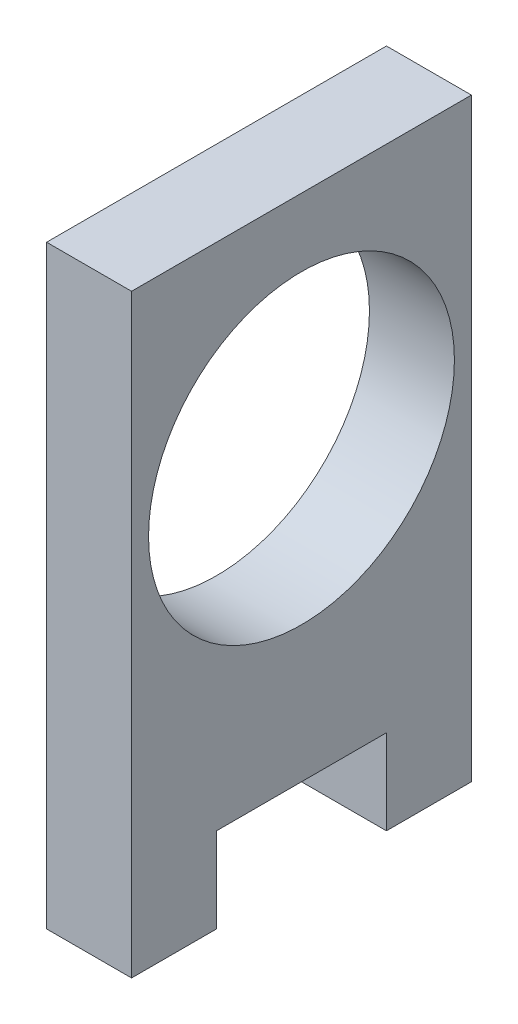
ISO-10303-21;
HEADER;
FILE_DESCRIPTION(('STEP AP214'),'2;1');
FILE_NAME('part.step','',(''),(''),'','','');
FILE_SCHEMA(('AUTOMOTIVE_DESIGN { 1 0 10303 214 1 1 1 1 }'));
ENDSEC;
DATA;
#1=APPLICATION_CONTEXT('core data for automotive mechanical design processes');
#2=APPLICATION_PROTOCOL_DEFINITION('international standard','automotive_design',2000,#1);
#3=PRODUCT_CONTEXT('',#1,'mechanical');
#4=PRODUCT('Part','Part','',(#3));
#5=PRODUCT_RELATED_PRODUCT_CATEGORY('part','',(#4));
#6=PRODUCT_DEFINITION_FORMATION('','',#4);
#7=PRODUCT_DEFINITION_CONTEXT('part definition',#1,'design');
#8=PRODUCT_DEFINITION('design','',#6,#7);
#9=PRODUCT_DEFINITION_SHAPE('','',#8);
#10=(LENGTH_UNIT() NAMED_UNIT(*) SI_UNIT(.MILLI.,.METRE.));
#11=(NAMED_UNIT(*) PLANE_ANGLE_UNIT() SI_UNIT($,.RADIAN.));
#12=(NAMED_UNIT(*) SI_UNIT($,.STERADIAN.) SOLID_ANGLE_UNIT());
#13=UNCERTAINTY_MEASURE_WITH_UNIT(LENGTH_MEASURE(1.E-05),#10,'distance_accuracy_value','');
#14=(GEOMETRIC_REPRESENTATION_CONTEXT(3) GLOBAL_UNCERTAINTY_ASSIGNED_CONTEXT((#13)) GLOBAL_UNIT_ASSIGNED_CONTEXT((#10,
#11,#12)) REPRESENTATION_CONTEXT('',''));
#15=CARTESIAN_POINT('',(0.,0.,0.));
#16=DIRECTION('',(0.,0.,1.));
#17=DIRECTION('',(1.,0.,0.));
#18=AXIS2_PLACEMENT_3D('',#15,#16,#17);
#19=CARTESIAN_POINT('',(6.35,0.,-6.35));
#20=DIRECTION('',(0.,0.,-1.));
#21=DIRECTION('',(-1.,0.,0.));
#22=AXIS2_PLACEMENT_3D('',#19,#20,#21);
#23=PLANE('',#22);
#24=DIRECTION('',(0.,-1.,0.));
#25=VECTOR('',#24,1.);
#26=CARTESIAN_POINT('',(0.,0.,-6.35));
#27=LINE('',#26,#25);
#28=CARTESIAN_POINT('',(0.,0.,-6.35));
#29=VERTEX_POINT('',#28);
#30=CARTESIAN_POINT('',(0.,-6.35,-6.35));
#31=VERTEX_POINT('',#30);
#32=EDGE_CURVE('E133',#29,#31,#27,.T.);
#33=ORIENTED_EDGE('',*,*,#32,.F.);
#34=DIRECTION('',(-1.,0.,0.));
#35=VECTOR('',#34,1.);
#36=CARTESIAN_POINT('',(6.35,0.,-6.35));
#37=LINE('',#36,#35);
#38=CARTESIAN_POINT('',(6.35,0.,-6.35));
#39=VERTEX_POINT('',#38);
#40=EDGE_CURVE('E11',#39,#29,#37,.T.);
#41=ORIENTED_EDGE('',*,*,#40,.F.);
#42=DIRECTION('',(0.,-1.,0.));
#43=VECTOR('',#42,1.);
#44=CARTESIAN_POINT('',(6.35,0.,-6.35));
#45=LINE('',#44,#43);
#46=CARTESIAN_POINT('',(6.35,-6.35,-6.35));
#47=VERTEX_POINT('',#46);
#48=EDGE_CURVE('E155',#39,#47,#45,.T.);
#49=ORIENTED_EDGE('',*,*,#48,.T.);
#50=DIRECTION('',(-1.,0.,0.));
#51=VECTOR('',#50,1.);
#52=CARTESIAN_POINT('',(6.35,-6.35,-6.35));
#53=LINE('',#52,#51);
#54=EDGE_CURVE('E85',#47,#31,#53,.T.);
#55=ORIENTED_EDGE('',*,*,#54,.T.);
#56=EDGE_LOOP('',(#33,#41,#49,#55));
#57=FACE_BOUND('',#56,.T.);
#58=ADVANCED_FACE('F35',(#57),#23,.T.);
#59=CARTESIAN_POINT('',(6.35,0.,0.));
#60=DIRECTION('',(0.,1.,0.));
#61=DIRECTION('',(0.,0.,1.));
#62=AXIS2_PLACEMENT_3D('',#59,#60,#61);
#63=PLANE('',#62);
#64=DIRECTION('',(0.,0.,-1.));
#65=VECTOR('',#64,1.);
#66=CARTESIAN_POINT('',(0.,0.,0.));
#67=LINE('',#66,#65);
#68=CARTESIAN_POINT('',(0.,0.,-19.05));
#69=VERTEX_POINT('',#68);
#70=EDGE_CURVE('E136',#29,#69,#67,.T.);
#71=ORIENTED_EDGE('',*,*,#70,.T.);
#72=DIRECTION('',(-1.,0.,0.));
#73=VECTOR('',#72,1.);
#74=CARTESIAN_POINT('',(6.35,0.,-19.05));
#75=LINE('',#74,#73);
#76=CARTESIAN_POINT('',(6.35,0.,-19.05));
#77=VERTEX_POINT('',#76);
#78=EDGE_CURVE('E43',#77,#69,#75,.T.);
#79=ORIENTED_EDGE('',*,*,#78,.F.);
#80=DIRECTION('',(0.,0.,-1.));
#81=VECTOR('',#80,1.);
#82=CARTESIAN_POINT('',(6.35,0.,0.));
#83=LINE('',#82,#81);
#84=EDGE_CURVE('E182',#39,#77,#83,.T.);
#85=ORIENTED_EDGE('',*,*,#84,.F.);
#86=ORIENTED_EDGE('',*,*,#40,.T.);
#87=EDGE_LOOP('',(#71,#79,#85,#86));
#88=FACE_BOUND('',#87,.T.);
#89=ADVANCED_FACE('F186',(#88),#63,.F.);
#90=CARTESIAN_POINT('',(6.35,0.,-19.05));
#91=DIRECTION('',(0.,0.,-1.));
#92=DIRECTION('',(-1.,0.,0.));
#93=AXIS2_PLACEMENT_3D('',#90,#91,#92);
#94=PLANE('',#93);
#95=DIRECTION('',(0.,-1.,0.));
#96=VECTOR('',#95,1.);
#97=CARTESIAN_POINT('',(0.,0.,-19.05));
#98=LINE('',#97,#96);
#99=CARTESIAN_POINT('',(0.,-6.35,-19.05));
#100=VERTEX_POINT('',#99);
#101=EDGE_CURVE('E138',#69,#100,#98,.T.);
#102=ORIENTED_EDGE('',*,*,#101,.T.);
#103=DIRECTION('',(-1.,0.,0.));
#104=VECTOR('',#103,1.);
#105=CARTESIAN_POINT('',(6.35,-6.35,-19.05));
#106=LINE('',#105,#104);
#107=CARTESIAN_POINT('',(6.35,-6.35,-19.05));
#108=VERTEX_POINT('',#107);
#109=EDGE_CURVE('E161',#108,#100,#106,.T.);
#110=ORIENTED_EDGE('',*,*,#109,.F.);
#111=DIRECTION('',(0.,-1.,0.));
#112=VECTOR('',#111,1.);
#113=CARTESIAN_POINT('',(6.35,0.,-19.05));
#114=LINE('',#113,#112);
#115=EDGE_CURVE('E169',#77,#108,#114,.T.);
#116=ORIENTED_EDGE('',*,*,#115,.F.);
#117=ORIENTED_EDGE('',*,*,#78,.T.);
#118=EDGE_LOOP('',(#102,#110,#116,#117));
#119=FACE_BOUND('',#118,.T.);
#120=ADVANCED_FACE('F167',(#119),#94,.F.);
#121=CARTESIAN_POINT('',(6.35,-6.35000000000001,0.));
#122=DIRECTION('',(0.,-1.,0.));
#123=DIRECTION('',(0.,0.,-1.));
#124=AXIS2_PLACEMENT_3D('',#121,#122,#123);
#125=PLANE('',#124);
#126=DIRECTION('',(0.,0.,1.));
#127=VECTOR('',#126,1.);
#128=CARTESIAN_POINT('',(0.,-6.35000000000001,0.));
#129=LINE('',#128,#127);
#130=CARTESIAN_POINT('',(0.,-6.35,-25.4));
#131=VERTEX_POINT('',#130);
#132=EDGE_CURVE('E141',#131,#100,#129,.T.);
#133=ORIENTED_EDGE('',*,*,#132,.F.);
#134=DIRECTION('',(-1.,0.,0.));
#135=VECTOR('',#134,1.);
#136=CARTESIAN_POINT('',(6.35,-6.35,-25.4));
#137=LINE('',#136,#135);
#138=CARTESIAN_POINT('',(6.35,-6.35,-25.4));
#139=VERTEX_POINT('',#138);
#140=EDGE_CURVE('E159',#139,#131,#137,.T.);
#141=ORIENTED_EDGE('',*,*,#140,.F.);
#142=DIRECTION('',(0.,0.,1.));
#143=VECTOR('',#142,1.);
#144=CARTESIAN_POINT('',(6.35,-6.35000000000001,0.));
#145=LINE('',#144,#143);
#146=EDGE_CURVE('E180',#139,#108,#145,.T.);
#147=ORIENTED_EDGE('',*,*,#146,.T.);
#148=ORIENTED_EDGE('',*,*,#109,.T.);
#149=EDGE_LOOP('',(#133,#141,#147,#148));
#150=FACE_BOUND('',#149,.T.);
#151=ADVANCED_FACE('F178',(#150),#125,.T.);
#152=CARTESIAN_POINT('',(6.35,0.,-25.4));
#153=DIRECTION('',(0.,0.,-1.));
#154=DIRECTION('',(0.,1.,0.));
#155=AXIS2_PLACEMENT_3D('',#152,#153,#154);
#156=PLANE('',#155);
#157=DIRECTION('',(0.,-1.,0.));
#158=VECTOR('',#157,1.);
#159=CARTESIAN_POINT('',(0.,0.,-25.4));
#160=LINE('',#159,#158);
#161=CARTESIAN_POINT('',(0.,38.1,-25.4));
#162=VERTEX_POINT('',#161);
#163=EDGE_CURVE('E144',#162,#131,#160,.T.);
#164=ORIENTED_EDGE('',*,*,#163,.F.);
#165=DIRECTION('',(-1.,0.,0.));
#166=VECTOR('',#165,1.);
#167=CARTESIAN_POINT('',(6.35,38.1,-25.4));
#168=LINE('',#167,#166);
#169=CARTESIAN_POINT('',(6.35,38.1,-25.4));
#170=VERTEX_POINT('',#169);
#171=EDGE_CURVE('E115',#170,#162,#168,.T.);
#172=ORIENTED_EDGE('',*,*,#171,.F.);
#173=DIRECTION('',(0.,-1.,0.));
#174=VECTOR('',#173,1.);
#175=CARTESIAN_POINT('',(6.35,0.,-25.4));
#176=LINE('',#175,#174);
#177=EDGE_CURVE('E123',#170,#139,#176,.T.);
#178=ORIENTED_EDGE('',*,*,#177,.T.);
#179=ORIENTED_EDGE('',*,*,#140,.T.);
#180=EDGE_LOOP('',(#164,#172,#178,#179));
#181=FACE_BOUND('',#180,.T.);
#182=ADVANCED_FACE('F196',(#181),#156,.T.);
#183=CARTESIAN_POINT('',(6.35,38.1,0.));
#184=DIRECTION('',(0.,1.,0.));
#185=DIRECTION('',(0.,0.,1.));
#186=AXIS2_PLACEMENT_3D('',#183,#184,#185);
#187=PLANE('',#186);
#188=DIRECTION('',(0.,0.,-1.));
#189=VECTOR('',#188,1.);
#190=CARTESIAN_POINT('',(0.,38.1,0.));
#191=LINE('',#190,#189);
#192=CARTESIAN_POINT('',(0.,38.1,0.));
#193=VERTEX_POINT('',#192);
#194=EDGE_CURVE('E110',#193,#162,#191,.T.);
#195=ORIENTED_EDGE('',*,*,#194,.F.);
#196=DIRECTION('',(-1.,0.,0.));
#197=VECTOR('',#196,1.);
#198=CARTESIAN_POINT('',(6.35,38.1,0.));
#199=LINE('',#198,#197);
#200=CARTESIAN_POINT('',(6.35,38.1,0.));
#201=VERTEX_POINT('',#200);
#202=EDGE_CURVE('E105',#201,#193,#199,.T.);
#203=ORIENTED_EDGE('',*,*,#202,.F.);
#204=DIRECTION('',(0.,0.,-1.));
#205=VECTOR('',#204,1.);
#206=CARTESIAN_POINT('',(6.35,38.1,0.));
#207=LINE('',#206,#205);
#208=EDGE_CURVE('E108',#201,#170,#207,.T.);
#209=ORIENTED_EDGE('',*,*,#208,.T.);
#210=ORIENTED_EDGE('',*,*,#171,.T.);
#211=EDGE_LOOP('',(#195,#203,#209,#210));
#212=FACE_BOUND('',#211,.T.);
#213=ADVANCED_FACE('F107',(#212),#187,.T.);
#214=CARTESIAN_POINT('',(6.35,0.,0.));
#215=DIRECTION('',(0.,0.,1.));
#216=DIRECTION('',(1.,0.,0.));
#217=AXIS2_PLACEMENT_3D('',#214,#215,#216);
#218=PLANE('',#217);
#219=DIRECTION('',(0.,1.,0.));
#220=VECTOR('',#219,1.);
#221=CARTESIAN_POINT('',(0.,0.,0.));
#222=LINE('',#221,#220);
#223=CARTESIAN_POINT('',(0.,-6.35,0.));
#224=VERTEX_POINT('',#223);
#225=EDGE_CURVE('E148',#224,#193,#222,.T.);
#226=ORIENTED_EDGE('',*,*,#225,.F.);
#227=DIRECTION('',(-1.,0.,0.));
#228=VECTOR('',#227,1.);
#229=CARTESIAN_POINT('',(6.35,-6.35,0.));
#230=LINE('',#229,#228);
#231=CARTESIAN_POINT('',(6.35,-6.35,0.));
#232=VERTEX_POINT('',#231);
#233=EDGE_CURVE('E78',#232,#224,#230,.T.);
#234=ORIENTED_EDGE('',*,*,#233,.F.);
#235=DIRECTION('',(0.,1.,0.));
#236=VECTOR('',#235,1.);
#237=CARTESIAN_POINT('',(6.35,0.,0.));
#238=LINE('',#237,#236);
#239=EDGE_CURVE('E120',#232,#201,#238,.T.);
#240=ORIENTED_EDGE('',*,*,#239,.T.);
#241=ORIENTED_EDGE('',*,*,#202,.T.);
#242=EDGE_LOOP('',(#226,#234,#240,#241));
#243=FACE_BOUND('',#242,.T.);
#244=ADVANCED_FACE('F125',(#243),#218,.T.);
#245=CARTESIAN_POINT('',(6.35,-6.35,0.));
#246=DIRECTION('',(0.,1.,0.));
#247=DIRECTION('',(0.,0.,1.));
#248=AXIS2_PLACEMENT_3D('',#245,#246,#247);
#249=PLANE('',#248);
#250=DIRECTION('',(0.,0.,-1.));
#251=VECTOR('',#250,1.);
#252=CARTESIAN_POINT('',(0.,-6.35,0.));
#253=LINE('',#252,#251);
#254=EDGE_CURVE('E150',#224,#31,#253,.T.);
#255=ORIENTED_EDGE('',*,*,#254,.T.);
#256=ORIENTED_EDGE('',*,*,#54,.F.);
#257=DIRECTION('',(0.,0.,-1.));
#258=VECTOR('',#257,1.);
#259=CARTESIAN_POINT('',(6.35,-6.35,0.));
#260=LINE('',#259,#258);
#261=EDGE_CURVE('E51',#232,#47,#260,.T.);
#262=ORIENTED_EDGE('',*,*,#261,.F.);
#263=ORIENTED_EDGE('',*,*,#233,.T.);
#264=EDGE_LOOP('',(#255,#256,#262,#263));
#265=FACE_BOUND('',#264,.T.);
#266=ADVANCED_FACE('F204',(#265),#249,.F.);
#267=CARTESIAN_POINT('',(6.35,21.59,-12.7));
#268=DIRECTION('',(-1.,0.,0.));
#269=DIRECTION('',(0.,0.,1.));
#270=AXIS2_PLACEMENT_3D('',#267,#268,#269);
#271=CYLINDRICAL_SURFACE('',#270,11.43);
#272=CARTESIAN_POINT('',(6.35,21.59,-12.7));
#273=DIRECTION('',(1.,0.,0.));
#274=DIRECTION('',(0.,0.,-1.));
#275=AXIS2_PLACEMENT_3D('',#272,#273,#274);
#276=CIRCLE('',#275,11.43);
#277=CARTESIAN_POINT('',(6.35,21.59,-24.13));
#278=VERTEX_POINT('',#277);
#279=EDGE_CURVE('E127',#278,#278,#276,.T.);
#280=ORIENTED_EDGE('',*,*,#279,.T.);
#281=EDGE_LOOP('',(#280));
#282=FACE_BOUND('',#281,.T.);
#283=CARTESIAN_POINT('',(0.,21.59,-12.7));
#284=DIRECTION('',(1.,0.,0.));
#285=DIRECTION('',(0.,0.,-1.));
#286=AXIS2_PLACEMENT_3D('',#283,#284,#285);
#287=CIRCLE('',#286,11.43);
#288=CARTESIAN_POINT('',(0.,21.59,-24.13));
#289=VERTEX_POINT('',#288);
#290=EDGE_CURVE('E152',#289,#289,#287,.T.);
#291=ORIENTED_EDGE('',*,*,#290,.F.);
#292=EDGE_LOOP('',(#291));
#293=FACE_BOUND('',#292,.T.);
#294=ADVANCED_FACE('F207',(#282,#293),#271,.F.);
#295=CARTESIAN_POINT('',(6.35,0.,0.));
#296=DIRECTION('',(1.,0.,0.));
#297=DIRECTION('',(0.,0.,-1.));
#298=AXIS2_PLACEMENT_3D('',#295,#296,#297);
#299=PLANE('',#298);
#300=ORIENTED_EDGE('',*,*,#48,.F.);
#301=ORIENTED_EDGE('',*,*,#84,.T.);
#302=ORIENTED_EDGE('',*,*,#115,.T.);
#303=ORIENTED_EDGE('',*,*,#146,.F.);
#304=ORIENTED_EDGE('',*,*,#177,.F.);
#305=ORIENTED_EDGE('',*,*,#208,.F.);
#306=ORIENTED_EDGE('',*,*,#239,.F.);
#307=ORIENTED_EDGE('',*,*,#261,.T.);
#308=EDGE_LOOP('',(#300,#301,#302,#303,#304,#305,#306,#307));
#309=FACE_BOUND('',#308,.T.);
#310=ORIENTED_EDGE('',*,*,#279,.F.);
#311=EDGE_LOOP('',(#310));
#312=FACE_BOUND('',#311,.T.);
#313=ADVANCED_FACE('F118',(#309,#312),#299,.T.);
#314=CARTESIAN_POINT('',(0.,0.,0.));
#315=DIRECTION('',(1.,0.,0.));
#316=DIRECTION('',(0.,0.,-1.));
#317=AXIS2_PLACEMENT_3D('',#314,#315,#316);
#318=PLANE('',#317);
#319=ORIENTED_EDGE('',*,*,#32,.T.);
#320=ORIENTED_EDGE('',*,*,#254,.F.);
#321=ORIENTED_EDGE('',*,*,#225,.T.);
#322=ORIENTED_EDGE('',*,*,#194,.T.);
#323=ORIENTED_EDGE('',*,*,#163,.T.);
#324=ORIENTED_EDGE('',*,*,#132,.T.);
#325=ORIENTED_EDGE('',*,*,#101,.F.);
#326=ORIENTED_EDGE('',*,*,#70,.F.);
#327=EDGE_LOOP('',(#319,#320,#321,#322,#323,#324,#325,#326));
#328=FACE_BOUND('',#327,.T.);
#329=ORIENTED_EDGE('',*,*,#290,.T.);
#330=EDGE_LOOP('',(#329));
#331=FACE_BOUND('',#330,.T.);
#332=ADVANCED_FACE('F173',(#328,#331),#318,.F.);
#333=CLOSED_SHELL('',(#58,#89,#120,#151,#182,#213,#244,#266,#294,#313,#332));
#334=MANIFOLD_SOLID_BREP('B2',#333);
#335=ADVANCED_BREP_SHAPE_REPRESENTATION('',(#18,#334),#14);
#336=SHAPE_DEFINITION_REPRESENTATION(#9,#335);
ENDSEC;
END-ISO-10303-21;
